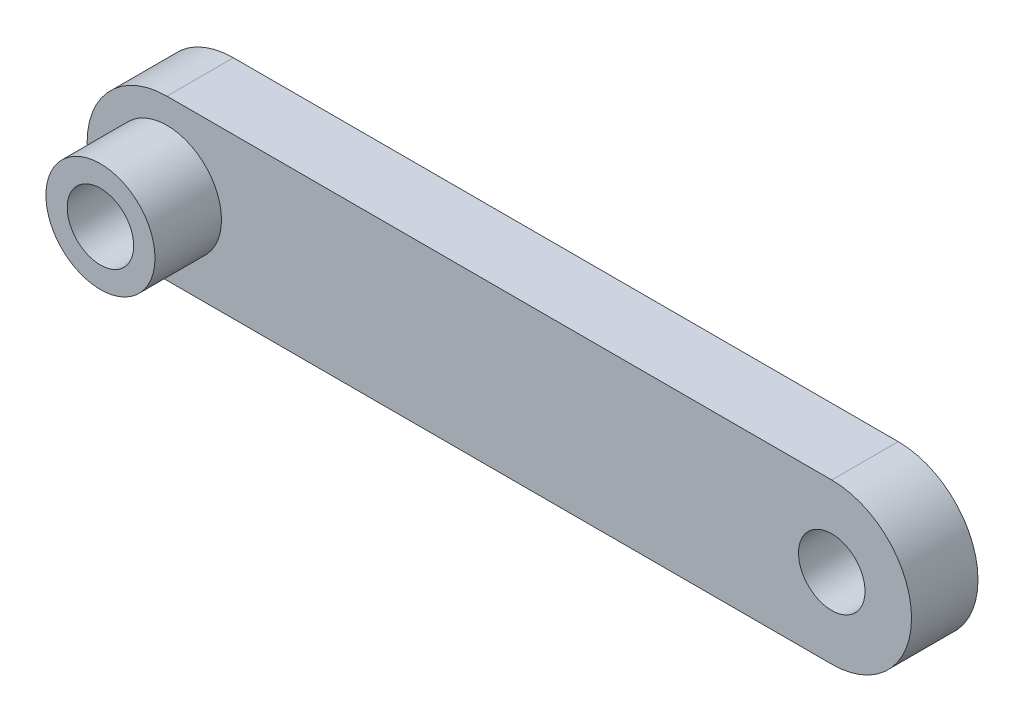
ISO-10303-21;
HEADER;
FILE_DESCRIPTION(('STEP AP214'),'2;1');
FILE_NAME('part.step','',(''),(''),'','','');
FILE_SCHEMA(('AUTOMOTIVE_DESIGN { 1 0 10303 214 1 1 1 1 }'));
ENDSEC;
DATA;
#1=APPLICATION_CONTEXT('core data for automotive mechanical design processes');
#2=APPLICATION_PROTOCOL_DEFINITION('international standard','automotive_design',2000,#1);
#3=PRODUCT_CONTEXT('',#1,'mechanical');
#4=PRODUCT('Part','Part','',(#3));
#5=PRODUCT_RELATED_PRODUCT_CATEGORY('part','',(#4));
#6=PRODUCT_DEFINITION_FORMATION('','',#4);
#7=PRODUCT_DEFINITION_CONTEXT('part definition',#1,'design');
#8=PRODUCT_DEFINITION('design','',#6,#7);
#9=PRODUCT_DEFINITION_SHAPE('','',#8);
#10=(LENGTH_UNIT() NAMED_UNIT(*) SI_UNIT(.MILLI.,.METRE.));
#11=(NAMED_UNIT(*) PLANE_ANGLE_UNIT() SI_UNIT($,.RADIAN.));
#12=(NAMED_UNIT(*) SI_UNIT($,.STERADIAN.) SOLID_ANGLE_UNIT());
#13=UNCERTAINTY_MEASURE_WITH_UNIT(LENGTH_MEASURE(1.E-05),#10,'distance_accuracy_value','');
#14=(GEOMETRIC_REPRESENTATION_CONTEXT(3) GLOBAL_UNCERTAINTY_ASSIGNED_CONTEXT((#13)) GLOBAL_UNIT_ASSIGNED_CONTEXT((#10,
#11,#12)) REPRESENTATION_CONTEXT('',''));
#15=CARTESIAN_POINT('',(0.,0.,0.));
#16=DIRECTION('',(0.,0.,1.));
#17=DIRECTION('',(1.,0.,0.));
#18=AXIS2_PLACEMENT_3D('',#15,#16,#17);
#19=CARTESIAN_POINT('',(0.,0.,12.7));
#20=DIRECTION('',(0.,0.,-1.));
#21=DIRECTION('',(-1.,0.,0.));
#22=AXIS2_PLACEMENT_3D('',#19,#20,#21);
#23=CYLINDRICAL_SURFACE('',#22,15.24);
#24=CARTESIAN_POINT('',(0.,0.,0.));
#25=DIRECTION('',(0.,0.,1.));
#26=DIRECTION('',(1.,0.,0.));
#27=AXIS2_PLACEMENT_3D('',#24,#25,#26);
#28=CIRCLE('',#27,15.24);
#29=CARTESIAN_POINT('',(0.,15.24,0.));
#30=VERTEX_POINT('',#29);
#31=CARTESIAN_POINT('',(0.,-15.24,0.));
#32=VERTEX_POINT('',#31);
#33=EDGE_CURVE('E99',#30,#32,#28,.T.);
#34=ORIENTED_EDGE('',*,*,#33,.T.);
#35=DIRECTION('',(0.,0.,-1.));
#36=VECTOR('',#35,1.);
#37=CARTESIAN_POINT('',(0.,-15.24,12.7));
#38=LINE('',#37,#36);
#39=CARTESIAN_POINT('',(0.,-15.24,12.7));
#40=VERTEX_POINT('',#39);
#41=EDGE_CURVE('E11',#40,#32,#38,.T.);
#42=ORIENTED_EDGE('',*,*,#41,.F.);
#43=CARTESIAN_POINT('',(0.,0.,12.7));
#44=DIRECTION('',(0.,0.,1.));
#45=DIRECTION('',(1.,0.,0.));
#46=AXIS2_PLACEMENT_3D('',#43,#44,#45);
#47=CIRCLE('',#46,15.24);
#48=CARTESIAN_POINT('',(0.,15.24,12.7));
#49=VERTEX_POINT('',#48);
#50=EDGE_CURVE('E87',#49,#40,#47,.T.);
#51=ORIENTED_EDGE('',*,*,#50,.F.);
#52=DIRECTION('',(0.,0.,-1.));
#53=VECTOR('',#52,1.);
#54=CARTESIAN_POINT('',(0.,15.24,12.7));
#55=LINE('',#54,#53);
#56=EDGE_CURVE('E95',#49,#30,#55,.T.);
#57=ORIENTED_EDGE('',*,*,#56,.T.);
#58=EDGE_LOOP('',(#34,#42,#51,#57));
#59=FACE_BOUND('',#58,.T.);
#60=ADVANCED_FACE('F36',(#59),#23,.T.);
#61=CARTESIAN_POINT('',(0.,-15.24,12.7));
#62=DIRECTION('',(0.,1.,0.));
#63=DIRECTION('',(0.,0.,1.));
#64=AXIS2_PLACEMENT_3D('',#61,#62,#63);
#65=PLANE('',#64);
#66=DIRECTION('',(1.,0.,0.));
#67=VECTOR('',#66,1.);
#68=CARTESIAN_POINT('',(0.,-15.24,0.));
#69=LINE('',#68,#67);
#70=CARTESIAN_POINT('',(127.,-15.24,0.));
#71=VERTEX_POINT('',#70);
#72=EDGE_CURVE('E91',#32,#71,#69,.T.);
#73=ORIENTED_EDGE('',*,*,#72,.T.);
#74=DIRECTION('',(0.,0.,-1.));
#75=VECTOR('',#74,1.);
#76=CARTESIAN_POINT('',(127.,-15.24,12.7));
#77=LINE('',#76,#75);
#78=CARTESIAN_POINT('',(127.,-15.24,12.7));
#79=VERTEX_POINT('',#78);
#80=EDGE_CURVE('E44',#79,#71,#77,.T.);
#81=ORIENTED_EDGE('',*,*,#80,.F.);
#82=DIRECTION('',(1.,0.,0.));
#83=VECTOR('',#82,1.);
#84=CARTESIAN_POINT('',(0.,-15.24,12.7));
#85=LINE('',#84,#83);
#86=EDGE_CURVE('E82',#40,#79,#85,.T.);
#87=ORIENTED_EDGE('',*,*,#86,.F.);
#88=ORIENTED_EDGE('',*,*,#41,.T.);
#89=EDGE_LOOP('',(#73,#81,#87,#88));
#90=FACE_BOUND('',#89,.T.);
#91=ADVANCED_FACE('F90',(#90),#65,.F.);
#92=CARTESIAN_POINT('',(127.,0.,12.7));
#93=DIRECTION('',(0.,0.,-1.));
#94=DIRECTION('',(-1.,0.,0.));
#95=AXIS2_PLACEMENT_3D('',#92,#93,#94);
#96=CYLINDRICAL_SURFACE('',#95,15.24);
#97=CARTESIAN_POINT('',(127.,0.,0.));
#98=DIRECTION('',(0.,0.,1.));
#99=DIRECTION('',(1.,0.,0.));
#100=AXIS2_PLACEMENT_3D('',#97,#98,#99);
#101=CIRCLE('',#100,15.24);
#102=CARTESIAN_POINT('',(127.,15.24,0.));
#103=VERTEX_POINT('',#102);
#104=EDGE_CURVE('E69',#71,#103,#101,.T.);
#105=ORIENTED_EDGE('',*,*,#104,.T.);
#106=DIRECTION('',(0.,0.,-1.));
#107=VECTOR('',#106,1.);
#108=CARTESIAN_POINT('',(127.,15.24,12.7));
#109=LINE('',#108,#107);
#110=CARTESIAN_POINT('',(127.,15.24,12.7));
#111=VERTEX_POINT('',#110);
#112=EDGE_CURVE('E92',#111,#103,#109,.T.);
#113=ORIENTED_EDGE('',*,*,#112,.F.);
#114=CARTESIAN_POINT('',(127.,0.,12.7));
#115=DIRECTION('',(0.,0.,1.));
#116=DIRECTION('',(1.,0.,0.));
#117=AXIS2_PLACEMENT_3D('',#114,#115,#116);
#118=CIRCLE('',#117,15.24);
#119=EDGE_CURVE('E85',#79,#111,#118,.T.);
#120=ORIENTED_EDGE('',*,*,#119,.F.);
#121=ORIENTED_EDGE('',*,*,#80,.T.);
#122=EDGE_LOOP('',(#105,#113,#120,#121));
#123=FACE_BOUND('',#122,.T.);
#124=ADVANCED_FACE('F93',(#123),#96,.T.);
#125=CARTESIAN_POINT('',(0.,15.24,12.7));
#126=DIRECTION('',(0.,-1.,0.));
#127=DIRECTION('',(0.,0.,-1.));
#128=AXIS2_PLACEMENT_3D('',#125,#126,#127);
#129=PLANE('',#128);
#130=DIRECTION('',(-1.,0.,0.));
#131=VECTOR('',#130,1.);
#132=CARTESIAN_POINT('',(0.,15.24,0.));
#133=LINE('',#132,#131);
#134=EDGE_CURVE('E75',#103,#30,#133,.T.);
#135=ORIENTED_EDGE('',*,*,#134,.T.);
#136=ORIENTED_EDGE('',*,*,#56,.F.);
#137=DIRECTION('',(-1.,0.,0.));
#138=VECTOR('',#137,1.);
#139=CARTESIAN_POINT('',(0.,15.24,12.7));
#140=LINE('',#139,#138);
#141=EDGE_CURVE('E52',#111,#49,#140,.T.);
#142=ORIENTED_EDGE('',*,*,#141,.F.);
#143=ORIENTED_EDGE('',*,*,#112,.T.);
#144=EDGE_LOOP('',(#135,#136,#142,#143));
#145=FACE_BOUND('',#144,.T.);
#146=ADVANCED_FACE('F107',(#145),#129,.F.);
#147=CARTESIAN_POINT('',(0.,0.,12.7));
#148=DIRECTION('',(0.,0.,1.));
#149=DIRECTION('',(1.,0.,0.));
#150=AXIS2_PLACEMENT_3D('',#147,#148,#149);
#151=PLANE('',#150);
#152=CARTESIAN_POINT('',(127.,0.,12.7));
#153=DIRECTION('',(0.,0.,1.));
#154=DIRECTION('',(1.,0.,0.));
#155=AXIS2_PLACEMENT_3D('',#152,#153,#154);
#156=CIRCLE('',#155,6.35);
#157=CARTESIAN_POINT('',(133.35,0.,12.7));
#158=VERTEX_POINT('',#157);
#159=EDGE_CURVE('E124',#158,#158,#156,.T.);
#160=ORIENTED_EDGE('',*,*,#159,.F.);
#161=EDGE_LOOP('',(#160));
#162=FACE_BOUND('',#161,.T.);
#163=CARTESIAN_POINT('',(0.,0.,12.7));
#164=DIRECTION('',(0.,0.,1.));
#165=DIRECTION('',(1.,0.,0.));
#166=AXIS2_PLACEMENT_3D('',#163,#164,#165);
#167=CIRCLE('',#166,10.419425034639);
#168=CARTESIAN_POINT('',(10.419425034639,0.,12.7));
#169=VERTEX_POINT('',#168);
#170=EDGE_CURVE('E113',#169,#169,#167,.T.);
#171=ORIENTED_EDGE('',*,*,#170,.F.);
#172=EDGE_LOOP('',(#171));
#173=FACE_BOUND('',#172,.T.);
#174=ORIENTED_EDGE('',*,*,#50,.T.);
#175=ORIENTED_EDGE('',*,*,#86,.T.);
#176=ORIENTED_EDGE('',*,*,#119,.T.);
#177=ORIENTED_EDGE('',*,*,#141,.T.);
#178=EDGE_LOOP('',(#174,#175,#176,#177));
#179=FACE_BOUND('',#178,.T.);
#180=ADVANCED_FACE('F83',(#162,#173,#179),#151,.T.);
#181=CARTESIAN_POINT('',(0.,0.,0.));
#182=DIRECTION('',(0.,0.,1.));
#183=DIRECTION('',(1.,0.,0.));
#184=AXIS2_PLACEMENT_3D('',#181,#182,#183);
#185=PLANE('',#184);
#186=CARTESIAN_POINT('',(127.,0.,0.));
#187=DIRECTION('',(0.,0.,1.));
#188=DIRECTION('',(1.,0.,0.));
#189=AXIS2_PLACEMENT_3D('',#186,#187,#188);
#190=CIRCLE('',#189,6.35);
#191=CARTESIAN_POINT('',(133.35,0.,0.));
#192=VERTEX_POINT('',#191);
#193=EDGE_CURVE('E127',#192,#192,#190,.T.);
#194=ORIENTED_EDGE('',*,*,#193,.T.);
#195=EDGE_LOOP('',(#194));
#196=FACE_BOUND('',#195,.T.);
#197=CARTESIAN_POINT('',(0.,0.,0.));
#198=DIRECTION('',(0.,0.,1.));
#199=DIRECTION('',(1.,0.,0.));
#200=AXIS2_PLACEMENT_3D('',#197,#198,#199);
#201=CIRCLE('',#200,6.35);
#202=CARTESIAN_POINT('',(6.35,0.,0.));
#203=VERTEX_POINT('',#202);
#204=EDGE_CURVE('E116',#203,#203,#201,.T.);
#205=ORIENTED_EDGE('',*,*,#204,.T.);
#206=EDGE_LOOP('',(#205));
#207=FACE_BOUND('',#206,.T.);
#208=ORIENTED_EDGE('',*,*,#33,.F.);
#209=ORIENTED_EDGE('',*,*,#134,.F.);
#210=ORIENTED_EDGE('',*,*,#104,.F.);
#211=ORIENTED_EDGE('',*,*,#72,.F.);
#212=EDGE_LOOP('',(#208,#209,#210,#211));
#213=FACE_BOUND('',#212,.T.);
#214=ADVANCED_FACE('F110',(#196,#207,#213),#185,.F.);
#215=CARTESIAN_POINT('',(0.,0.,25.4));
#216=DIRECTION('',(0.,0.,-1.));
#217=DIRECTION('',(-1.,0.,0.));
#218=AXIS2_PLACEMENT_3D('',#215,#216,#217);
#219=CYLINDRICAL_SURFACE('',#218,10.419425034639);
#220=CARTESIAN_POINT('',(0.,0.,25.4));
#221=DIRECTION('',(0.,0.,1.));
#222=DIRECTION('',(1.,0.,0.));
#223=AXIS2_PLACEMENT_3D('',#220,#221,#222);
#224=CIRCLE('',#223,10.419425034639);
#225=CARTESIAN_POINT('',(10.419425034639,0.,25.4));
#226=VERTEX_POINT('',#225);
#227=EDGE_CURVE('E102',#226,#226,#224,.T.);
#228=ORIENTED_EDGE('',*,*,#227,.F.);
#229=EDGE_LOOP('',(#228));
#230=FACE_BOUND('',#229,.T.);
#231=ORIENTED_EDGE('',*,*,#170,.T.);
#232=EDGE_LOOP('',(#231));
#233=FACE_BOUND('',#232,.T.);
#234=ADVANCED_FACE('F157',(#230,#233),#219,.T.);
#235=CARTESIAN_POINT('',(0.,0.,25.4));
#236=DIRECTION('',(0.,0.,1.));
#237=DIRECTION('',(1.,0.,0.));
#238=AXIS2_PLACEMENT_3D('',#235,#236,#237);
#239=PLANE('',#238);
#240=CARTESIAN_POINT('',(0.,0.,25.4));
#241=DIRECTION('',(0.,0.,1.));
#242=DIRECTION('',(1.,0.,0.));
#243=AXIS2_PLACEMENT_3D('',#240,#241,#242);
#244=CIRCLE('',#243,6.35);
#245=CARTESIAN_POINT('',(6.35,0.,25.4));
#246=VERTEX_POINT('',#245);
#247=EDGE_CURVE('E121',#246,#246,#244,.T.);
#248=ORIENTED_EDGE('',*,*,#247,.F.);
#249=EDGE_LOOP('',(#248));
#250=FACE_BOUND('',#249,.T.);
#251=ORIENTED_EDGE('',*,*,#227,.T.);
#252=EDGE_LOOP('',(#251));
#253=FACE_BOUND('',#252,.T.);
#254=ADVANCED_FACE('F141',(#250,#253),#239,.T.);
#255=CARTESIAN_POINT('',(0.,0.,0.));
#256=DIRECTION('',(0.,0.,1.));
#257=DIRECTION('',(1.,0.,0.));
#258=AXIS2_PLACEMENT_3D('',#255,#256,#257);
#259=CYLINDRICAL_SURFACE('',#258,6.35);
#260=ORIENTED_EDGE('',*,*,#204,.F.);
#261=EDGE_LOOP('',(#260));
#262=FACE_BOUND('',#261,.T.);
#263=ORIENTED_EDGE('',*,*,#247,.T.);
#264=EDGE_LOOP('',(#263));
#265=FACE_BOUND('',#264,.T.);
#266=ADVANCED_FACE('F135',(#262,#265),#259,.F.);
#267=CARTESIAN_POINT('',(127.,0.,0.));
#268=DIRECTION('',(0.,0.,1.));
#269=DIRECTION('',(1.,0.,0.));
#270=AXIS2_PLACEMENT_3D('',#267,#268,#269);
#271=CYLINDRICAL_SURFACE('',#270,6.35);
#272=ORIENTED_EDGE('',*,*,#159,.T.);
#273=EDGE_LOOP('',(#272));
#274=FACE_BOUND('',#273,.T.);
#275=ORIENTED_EDGE('',*,*,#193,.F.);
#276=EDGE_LOOP('',(#275));
#277=FACE_BOUND('',#276,.T.);
#278=ADVANCED_FACE('F133',(#274,#277),#271,.F.);
#279=CLOSED_SHELL('',(#60,#91,#124,#146,#180,#214,#234,#254,#266,#278));
#280=MANIFOLD_SOLID_BREP('B2',#279);
#281=ADVANCED_BREP_SHAPE_REPRESENTATION('',(#18,#280),#14);
#282=SHAPE_DEFINITION_REPRESENTATION(#9,#281);
ENDSEC;
END-ISO-10303-21;
